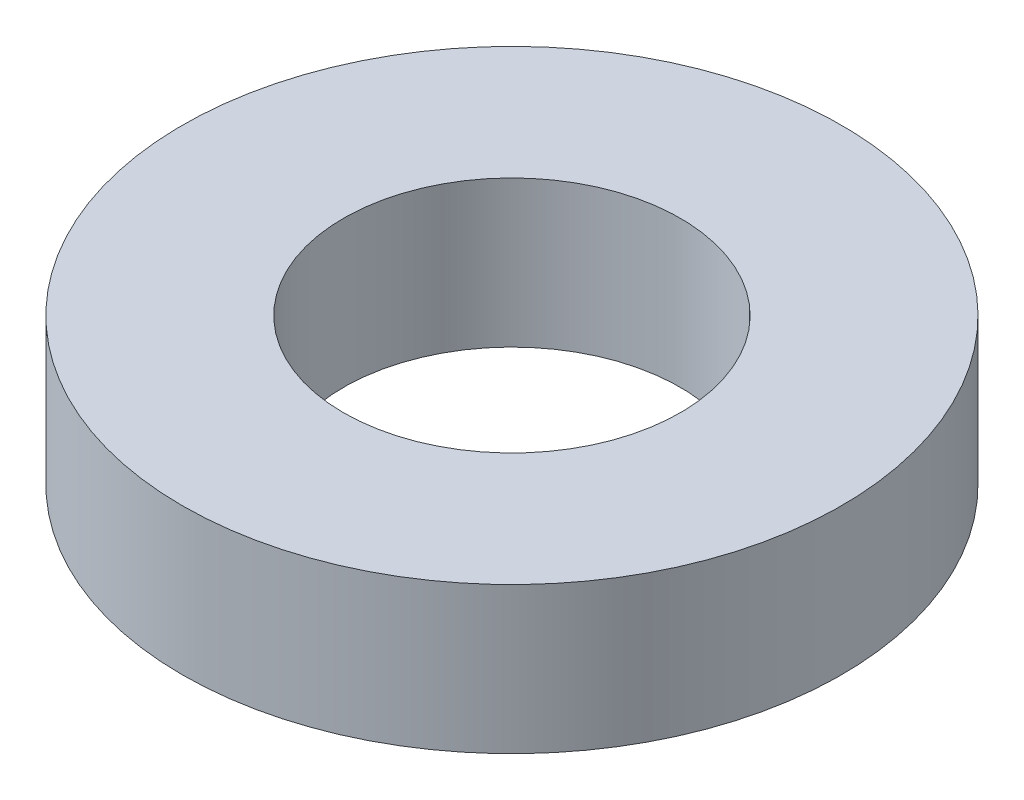
ISO-10303-21;
HEADER;
FILE_DESCRIPTION(('STEP AP214'),'2;1');
FILE_NAME('part.step','',(''),(''),'','','');
FILE_SCHEMA(('AUTOMOTIVE_DESIGN { 1 0 10303 214 1 1 1 1 }'));
ENDSEC;
DATA;
#1=APPLICATION_CONTEXT('core data for automotive mechanical design processes');
#2=APPLICATION_PROTOCOL_DEFINITION('international standard','automotive_design',2000,#1);
#3=PRODUCT_CONTEXT('',#1,'mechanical');
#4=PRODUCT('Part','Part','',(#3));
#5=PRODUCT_RELATED_PRODUCT_CATEGORY('part','',(#4));
#6=PRODUCT_DEFINITION_FORMATION('','',#4);
#7=PRODUCT_DEFINITION_CONTEXT('part definition',#1,'design');
#8=PRODUCT_DEFINITION('design','',#6,#7);
#9=PRODUCT_DEFINITION_SHAPE('','',#8);
#10=(LENGTH_UNIT() NAMED_UNIT(*) SI_UNIT(.MILLI.,.METRE.));
#11=(NAMED_UNIT(*) PLANE_ANGLE_UNIT() SI_UNIT($,.RADIAN.));
#12=(NAMED_UNIT(*) SI_UNIT($,.STERADIAN.) SOLID_ANGLE_UNIT());
#13=UNCERTAINTY_MEASURE_WITH_UNIT(LENGTH_MEASURE(1.E-05),#10,'distance_accuracy_value','');
#14=(GEOMETRIC_REPRESENTATION_CONTEXT(3) GLOBAL_UNCERTAINTY_ASSIGNED_CONTEXT((#13)) GLOBAL_UNIT_ASSIGNED_CONTEXT((#10,
#11,#12)) REPRESENTATION_CONTEXT('',''));
#15=CARTESIAN_POINT('',(0.,0.,0.));
#16=DIRECTION('',(0.,0.,1.));
#17=DIRECTION('',(1.,0.,0.));
#18=AXIS2_PLACEMENT_3D('',#15,#16,#17);
#19=CARTESIAN_POINT('',(0.,1.,0.));
#20=DIRECTION('',(0.,1.,0.));
#21=DIRECTION('',(0.,0.,1.));
#22=AXIS2_PLACEMENT_3D('',#19,#20,#21);
#23=PLANE('',#22);
#24=CARTESIAN_POINT('',(0.,1.,0.));
#25=DIRECTION('',(0.,1.,0.));
#26=DIRECTION('',(0.,0.,1.));
#27=AXIS2_PLACEMENT_3D('',#24,#25,#26);
#28=CIRCLE('',#27,2.25);
#29=CARTESIAN_POINT('',(0.,1.,2.25));
#30=VERTEX_POINT('',#29);
#31=EDGE_CURVE('E10',#30,#30,#28,.T.);
#32=ORIENTED_EDGE('',*,*,#31,.T.);
#33=EDGE_LOOP('',(#32));
#34=FACE_BOUND('',#33,.T.);
#35=CARTESIAN_POINT('',(0.,1.,0.));
#36=DIRECTION('',(0.,1.,0.));
#37=DIRECTION('',(0.,0.,1.));
#38=AXIS2_PLACEMENT_3D('',#35,#36,#37);
#39=CIRCLE('',#38,1.15);
#40=CARTESIAN_POINT('',(0.,1.,1.15));
#41=VERTEX_POINT('',#40);
#42=EDGE_CURVE('E42',#41,#41,#39,.T.);
#43=ORIENTED_EDGE('',*,*,#42,.F.);
#44=EDGE_LOOP('',(#43));
#45=FACE_BOUND('',#44,.T.);
#46=ADVANCED_FACE('F31',(#34,#45),#23,.T.);
#47=CARTESIAN_POINT('',(0.,0.,0.));
#48=DIRECTION('',(0.,1.,0.));
#49=DIRECTION('',(0.,0.,1.));
#50=AXIS2_PLACEMENT_3D('',#47,#48,#49);
#51=PLANE('',#50);
#52=CARTESIAN_POINT('',(0.,0.,0.));
#53=DIRECTION('',(0.,1.,0.));
#54=DIRECTION('',(0.,0.,1.));
#55=AXIS2_PLACEMENT_3D('',#52,#53,#54);
#56=CIRCLE('',#55,2.25);
#57=CARTESIAN_POINT('',(0.,0.,2.25));
#58=VERTEX_POINT('',#57);
#59=EDGE_CURVE('E35',#58,#58,#56,.T.);
#60=ORIENTED_EDGE('',*,*,#59,.F.);
#61=EDGE_LOOP('',(#60));
#62=FACE_BOUND('',#61,.T.);
#63=CARTESIAN_POINT('',(0.,0.,0.));
#64=DIRECTION('',(0.,1.,0.));
#65=DIRECTION('',(0.,0.,1.));
#66=AXIS2_PLACEMENT_3D('',#63,#64,#65);
#67=CIRCLE('',#66,1.15);
#68=CARTESIAN_POINT('',(0.,0.,1.15));
#69=VERTEX_POINT('',#68);
#70=EDGE_CURVE('E44',#69,#69,#67,.T.);
#71=ORIENTED_EDGE('',*,*,#70,.T.);
#72=EDGE_LOOP('',(#71));
#73=FACE_BOUND('',#72,.T.);
#74=ADVANCED_FACE('F54',(#62,#73),#51,.F.);
#75=CARTESIAN_POINT('',(0.,1.,0.));
#76=DIRECTION('',(0.,-1.,0.));
#77=DIRECTION('',(0.,0.,-1.));
#78=AXIS2_PLACEMENT_3D('',#75,#76,#77);
#79=CYLINDRICAL_SURFACE('',#78,2.25);
#80=ORIENTED_EDGE('',*,*,#31,.F.);
#81=EDGE_LOOP('',(#80));
#82=FACE_BOUND('',#81,.T.);
#83=ORIENTED_EDGE('',*,*,#59,.T.);
#84=EDGE_LOOP('',(#83));
#85=FACE_BOUND('',#84,.T.);
#86=ADVANCED_FACE('F33',(#82,#85),#79,.T.);
#87=CARTESIAN_POINT('',(0.,1.,0.));
#88=DIRECTION('',(0.,-1.,0.));
#89=DIRECTION('',(0.,0.,-1.));
#90=AXIS2_PLACEMENT_3D('',#87,#88,#89);
#91=CYLINDRICAL_SURFACE('',#90,1.15);
#92=ORIENTED_EDGE('',*,*,#42,.T.);
#93=EDGE_LOOP('',(#92));
#94=FACE_BOUND('',#93,.T.);
#95=ORIENTED_EDGE('',*,*,#70,.F.);
#96=EDGE_LOOP('',(#95));
#97=FACE_BOUND('',#96,.T.);
#98=ADVANCED_FACE('F50',(#94,#97),#91,.F.);
#99=CLOSED_SHELL('',(#46,#74,#86,#98));
#100=MANIFOLD_SOLID_BREP('B2',#99);
#101=ADVANCED_BREP_SHAPE_REPRESENTATION('',(#18,#100),#14);
#102=SHAPE_DEFINITION_REPRESENTATION(#9,#101);
ENDSEC;
END-ISO-10303-21;
